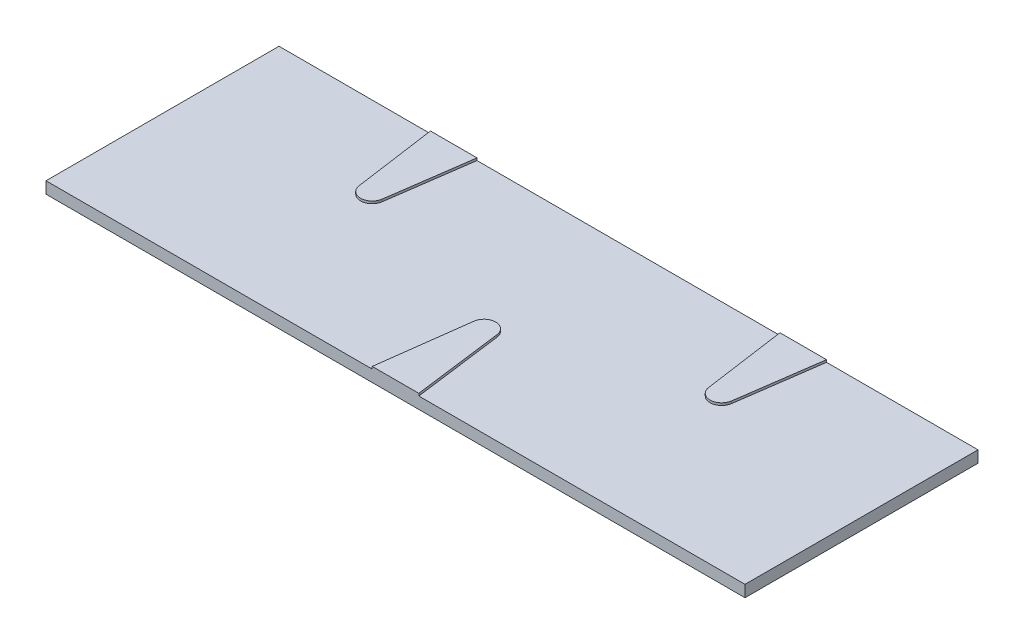
ISO-10303-21;
HEADER;
FILE_DESCRIPTION(('STEP AP214'),'2;1');
FILE_NAME('part.step','',(''),(''),'','','');
FILE_SCHEMA(('AUTOMOTIVE_DESIGN { 1 0 10303 214 1 1 1 1 }'));
ENDSEC;
DATA;
#1=APPLICATION_CONTEXT('core data for automotive mechanical design processes');
#2=APPLICATION_PROTOCOL_DEFINITION('international standard','automotive_design',2000,#1);
#3=PRODUCT_CONTEXT('',#1,'mechanical');
#4=PRODUCT('Part','Part','',(#3));
#5=PRODUCT_RELATED_PRODUCT_CATEGORY('part','',(#4));
#6=PRODUCT_DEFINITION_FORMATION('','',#4);
#7=PRODUCT_DEFINITION_CONTEXT('part definition',#1,'design');
#8=PRODUCT_DEFINITION('design','',#6,#7);
#9=PRODUCT_DEFINITION_SHAPE('','',#8);
#10=(LENGTH_UNIT() NAMED_UNIT(*) SI_UNIT(.MILLI.,.METRE.));
#11=(NAMED_UNIT(*) PLANE_ANGLE_UNIT() SI_UNIT($,.RADIAN.));
#12=(NAMED_UNIT(*) SI_UNIT($,.STERADIAN.) SOLID_ANGLE_UNIT());
#13=UNCERTAINTY_MEASURE_WITH_UNIT(LENGTH_MEASURE(1.E-05),#10,'distance_accuracy_value','');
#14=(GEOMETRIC_REPRESENTATION_CONTEXT(3) GLOBAL_UNCERTAINTY_ASSIGNED_CONTEXT((#13)) GLOBAL_UNIT_ASSIGNED_CONTEXT((#10,
#11,#12)) REPRESENTATION_CONTEXT('',''));
#15=CARTESIAN_POINT('',(0.,0.,0.));
#16=DIRECTION('',(0.,0.,1.));
#17=DIRECTION('',(1.,0.,0.));
#18=AXIS2_PLACEMENT_3D('',#15,#16,#17);
#19=CARTESIAN_POINT('',(0.,5.,0.));
#20=DIRECTION('',(0.,-1.,0.));
#21=DIRECTION('',(0.,0.,-1.));
#22=AXIS2_PLACEMENT_3D('',#19,#20,#21);
#23=PLANE('',#22);
#24=DIRECTION('',(-0.129367555309651,0.,0.991596710176675));
#25=VECTOR('',#24,1.);
#26=CARTESIAN_POINT('',(-10.,5.,50.));
#27=LINE('',#26,#25);
#28=CARTESIAN_POINT('',(-4.95798355088337,5.,11.3531622234518));
#29=VERTEX_POINT('',#28);
#30=CARTESIAN_POINT('',(-10.,5.,50.));
#31=VERTEX_POINT('',#30);
#32=EDGE_CURVE('E48',#29,#31,#27,.T.);
#33=ORIENTED_EDGE('',*,*,#32,.F.);
#34=CARTESIAN_POINT('',(0.,5.,12.));
#35=DIRECTION('',(0.,1.,0.));
#36=DIRECTION('',(0.,0.,-1.));
#37=AXIS2_PLACEMENT_3D('',#34,#35,#36);
#38=CIRCLE('',#37,5.);
#39=CARTESIAN_POINT('',(4.95798355088338,5.,11.3531622234518));
#40=VERTEX_POINT('',#39);
#41=EDGE_CURVE('E53',#40,#29,#38,.T.);
#42=ORIENTED_EDGE('',*,*,#41,.F.);
#43=DIRECTION('',(-0.129367555309651,0.,-0.991596710176675));
#44=VECTOR('',#43,1.);
#45=CARTESIAN_POINT('',(4.95798355088337,5.,11.3531622234518));
#46=LINE('',#45,#44);
#47=CARTESIAN_POINT('',(10.,5.,50.));
#48=VERTEX_POINT('',#47);
#49=EDGE_CURVE('E164',#48,#40,#46,.T.);
#50=ORIENTED_EDGE('',*,*,#49,.F.);
#51=DIRECTION('',(1.,0.,0.));
#52=VECTOR('',#51,1.);
#53=CARTESIAN_POINT('',(-150.,5.,50.));
#54=LINE('',#53,#52);
#55=CARTESIAN_POINT('',(150.,5.,50.));
#56=VERTEX_POINT('',#55);
#57=EDGE_CURVE('E243',#48,#56,#54,.T.);
#58=ORIENTED_EDGE('',*,*,#57,.T.);
#59=DIRECTION('',(0.,0.,-1.));
#60=VECTOR('',#59,1.);
#61=CARTESIAN_POINT('',(150.,5.,50.));
#62=LINE('',#61,#60);
#63=CARTESIAN_POINT('',(150.,5.,-50.));
#64=VERTEX_POINT('',#63);
#65=EDGE_CURVE('E233',#56,#64,#62,.T.);
#66=ORIENTED_EDGE('',*,*,#65,.T.);
#67=DIRECTION('',(-1.,0.,0.));
#68=VECTOR('',#67,1.);
#69=CARTESIAN_POINT('',(-150.,5.,-50.));
#70=LINE('',#69,#68);
#71=CARTESIAN_POINT('',(85.,5.,-50.));
#72=VERTEX_POINT('',#71);
#73=EDGE_CURVE('E238',#64,#72,#70,.T.);
#74=ORIENTED_EDGE('',*,*,#73,.T.);
#75=DIRECTION('',(0.140041605695395,0.,-0.990145619933884));
#76=VECTOR('',#75,1.);
#77=CARTESIAN_POINT('',(85.,5.,-50.));
#78=LINE('',#77,#76);
#79=CARTESIAN_POINT('',(79.9507280996694,5.,-14.299791971523));
#80=VERTEX_POINT('',#79);
#81=EDGE_CURVE('E170',#80,#72,#78,.T.);
#82=ORIENTED_EDGE('',*,*,#81,.F.);
#83=CARTESIAN_POINT('',(75.,5.,-15.));
#84=DIRECTION('',(0.,1.,0.));
#85=DIRECTION('',(0.,0.,-1.));
#86=AXIS2_PLACEMENT_3D('',#83,#84,#85);
#87=CIRCLE('',#86,4.99999999999999);
#88=CARTESIAN_POINT('',(70.0492719003306,5.,-14.299791971523));
#89=VERTEX_POINT('',#88);
#90=EDGE_CURVE('E167',#89,#80,#87,.T.);
#91=ORIENTED_EDGE('',*,*,#90,.F.);
#92=DIRECTION('',(0.140041605695396,0.,0.990145619933884));
#93=VECTOR('',#92,1.);
#94=CARTESIAN_POINT('',(70.0492719003306,5.,-14.299791971523));
#95=LINE('',#94,#93);
#96=CARTESIAN_POINT('',(65.,5.,-50.));
#97=VERTEX_POINT('',#96);
#98=EDGE_CURVE('E180',#97,#89,#95,.T.);
#99=ORIENTED_EDGE('',*,*,#98,.F.);
#100=CARTESIAN_POINT('',(-65.,5.,-50.));
#101=VERTEX_POINT('',#100);
#102=EDGE_CURVE('E241',#97,#101,#70,.T.);
#103=ORIENTED_EDGE('',*,*,#102,.T.);
#104=DIRECTION('',(0.140041605695396,0.,-0.990145619933884));
#105=VECTOR('',#104,1.);
#106=CARTESIAN_POINT('',(-70.0492719003306,5.,-14.299791971523));
#107=LINE('',#106,#105);
#108=CARTESIAN_POINT('',(-70.0492719003306,5.,-14.299791971523));
#109=VERTEX_POINT('',#108);
#110=EDGE_CURVE('E207',#109,#101,#107,.T.);
#111=ORIENTED_EDGE('',*,*,#110,.F.);
#112=CARTESIAN_POINT('',(-75.,5.,-15.));
#113=DIRECTION('',(0.,1.,0.));
#114=DIRECTION('',(0.,0.,1.));
#115=AXIS2_PLACEMENT_3D('',#112,#113,#114);
#116=CIRCLE('',#115,4.99999999999999);
#117=CARTESIAN_POINT('',(-79.9507280996694,5.,-14.299791971523));
#118=VERTEX_POINT('',#117);
#119=EDGE_CURVE('E216',#118,#109,#116,.T.);
#120=ORIENTED_EDGE('',*,*,#119,.F.);
#121=DIRECTION('',(0.140041605695395,0.,0.990145619933884));
#122=VECTOR('',#121,1.);
#123=CARTESIAN_POINT('',(-85.,5.,-50.));
#124=LINE('',#123,#122);
#125=CARTESIAN_POINT('',(-85.,5.,-50.));
#126=VERTEX_POINT('',#125);
#127=EDGE_CURVE('E202',#126,#118,#124,.T.);
#128=ORIENTED_EDGE('',*,*,#127,.F.);
#129=CARTESIAN_POINT('',(-150.,5.,-50.));
#130=VERTEX_POINT('',#129);
#131=EDGE_CURVE('E236',#126,#130,#70,.T.);
#132=ORIENTED_EDGE('',*,*,#131,.T.);
#133=DIRECTION('',(0.,0.,1.));
#134=VECTOR('',#133,1.);
#135=CARTESIAN_POINT('',(-150.,5.,50.));
#136=LINE('',#135,#134);
#137=CARTESIAN_POINT('',(-150.,5.,50.));
#138=VERTEX_POINT('',#137);
#139=EDGE_CURVE('E240',#130,#138,#136,.T.);
#140=ORIENTED_EDGE('',*,*,#139,.T.);
#141=EDGE_CURVE('E244',#138,#31,#54,.T.);
#142=ORIENTED_EDGE('',*,*,#141,.T.);
#143=EDGE_LOOP('',(#33,#42,#50,#58,#66,#74,#82,#91,#99,#103,#111,#120,#128,#132,#140,#142));
#144=FACE_BOUND('',#143,.T.);
#145=ADVANCED_FACE('F33',(#144),#23,.F.);
#146=CARTESIAN_POINT('',(150.,5.,50.));
#147=DIRECTION('',(-1.,0.,0.));
#148=DIRECTION('',(0.,0.,1.));
#149=AXIS2_PLACEMENT_3D('',#146,#147,#148);
#150=PLANE('',#149);
#151=DIRECTION('',(0.,0.,-1.));
#152=VECTOR('',#151,1.);
#153=CARTESIAN_POINT('',(150.,0.,50.));
#154=LINE('',#153,#152);
#155=CARTESIAN_POINT('',(150.,0.,50.));
#156=VERTEX_POINT('',#155);
#157=CARTESIAN_POINT('',(150.,0.,-50.));
#158=VERTEX_POINT('',#157);
#159=EDGE_CURVE('E232',#156,#158,#154,.T.);
#160=ORIENTED_EDGE('',*,*,#159,.T.);
#161=DIRECTION('',(0.,-1.,0.));
#162=VECTOR('',#161,1.);
#163=CARTESIAN_POINT('',(150.,5.,-50.));
#164=LINE('',#163,#162);
#165=EDGE_CURVE('E11',#64,#158,#164,.T.);
#166=ORIENTED_EDGE('',*,*,#165,.F.);
#167=ORIENTED_EDGE('',*,*,#65,.F.);
#168=DIRECTION('',(0.,-1.,0.));
#169=VECTOR('',#168,1.);
#170=CARTESIAN_POINT('',(150.,5.,50.));
#171=LINE('',#170,#169);
#172=EDGE_CURVE('E246',#56,#156,#171,.T.);
#173=ORIENTED_EDGE('',*,*,#172,.T.);
#174=EDGE_LOOP('',(#160,#166,#167,#173));
#175=FACE_BOUND('',#174,.T.);
#176=ADVANCED_FACE('F35',(#175),#150,.F.);
#177=CARTESIAN_POINT('',(-150.,5.,-50.));
#178=DIRECTION('',(0.,0.,1.));
#179=DIRECTION('',(1.,0.,0.));
#180=AXIS2_PLACEMENT_3D('',#177,#178,#179);
#181=PLANE('',#180);
#182=DIRECTION('',(-1.,0.,0.));
#183=VECTOR('',#182,1.);
#184=CARTESIAN_POINT('',(-150.,0.,-50.));
#185=LINE('',#184,#183);
#186=CARTESIAN_POINT('',(-150.,0.,-50.));
#187=VERTEX_POINT('',#186);
#188=EDGE_CURVE('E249',#158,#187,#185,.T.);
#189=ORIENTED_EDGE('',*,*,#188,.T.);
#190=DIRECTION('',(0.,-1.,0.));
#191=VECTOR('',#190,1.);
#192=CARTESIAN_POINT('',(-150.,5.,-50.));
#193=LINE('',#192,#191);
#194=EDGE_CURVE('E41',#130,#187,#193,.T.);
#195=ORIENTED_EDGE('',*,*,#194,.F.);
#196=ORIENTED_EDGE('',*,*,#131,.F.);
#197=DIRECTION('',(0.,-1.,0.));
#198=VECTOR('',#197,1.);
#199=CARTESIAN_POINT('',(-85.,6.,-50.));
#200=LINE('',#199,#198);
#201=CARTESIAN_POINT('',(-85.,6.,-50.));
#202=VERTEX_POINT('',#201);
#203=EDGE_CURVE('E229',#202,#126,#200,.T.);
#204=ORIENTED_EDGE('',*,*,#203,.F.);
#205=DIRECTION('',(-1.,0.,0.));
#206=VECTOR('',#205,1.);
#207=CARTESIAN_POINT('',(-85.,6.,-50.));
#208=LINE('',#207,#206);
#209=CARTESIAN_POINT('',(-65.,6.,-50.));
#210=VERTEX_POINT('',#209);
#211=EDGE_CURVE('E203',#210,#202,#208,.T.);
#212=ORIENTED_EDGE('',*,*,#211,.F.);
#213=DIRECTION('',(0.,-1.,0.));
#214=VECTOR('',#213,1.);
#215=CARTESIAN_POINT('',(-65.,6.,-50.));
#216=LINE('',#215,#214);
#217=EDGE_CURVE('E213',#210,#101,#216,.T.);
#218=ORIENTED_EDGE('',*,*,#217,.T.);
#219=ORIENTED_EDGE('',*,*,#102,.F.);
#220=DIRECTION('',(0.,-1.,0.));
#221=VECTOR('',#220,1.);
#222=CARTESIAN_POINT('',(65.,6.,-50.));
#223=LINE('',#222,#221);
#224=CARTESIAN_POINT('',(65.,6.,-50.));
#225=VERTEX_POINT('',#224);
#226=EDGE_CURVE('E193',#225,#97,#223,.T.);
#227=ORIENTED_EDGE('',*,*,#226,.F.);
#228=DIRECTION('',(-1.,0.,0.));
#229=VECTOR('',#228,1.);
#230=CARTESIAN_POINT('',(65.,6.,-50.));
#231=LINE('',#230,#229);
#232=CARTESIAN_POINT('',(85.,6.,-50.));
#233=VERTEX_POINT('',#232);
#234=EDGE_CURVE('E182',#233,#225,#231,.T.);
#235=ORIENTED_EDGE('',*,*,#234,.F.);
#236=DIRECTION('',(0.,-1.,0.));
#237=VECTOR('',#236,1.);
#238=CARTESIAN_POINT('',(85.,6.,-50.));
#239=LINE('',#238,#237);
#240=EDGE_CURVE('E196',#233,#72,#239,.T.);
#241=ORIENTED_EDGE('',*,*,#240,.T.);
#242=ORIENTED_EDGE('',*,*,#73,.F.);
#243=ORIENTED_EDGE('',*,*,#165,.T.);
#244=EDGE_LOOP('',(#189,#195,#196,#204,#212,#218,#219,#227,#235,#241,#242,#243));
#245=FACE_BOUND('',#244,.T.);
#246=ADVANCED_FACE('F298',(#245),#181,.F.);
#247=CARTESIAN_POINT('',(-150.,5.,50.));
#248=DIRECTION('',(1.,0.,0.));
#249=DIRECTION('',(0.,0.,-1.));
#250=AXIS2_PLACEMENT_3D('',#247,#248,#249);
#251=PLANE('',#250);
#252=DIRECTION('',(0.,0.,1.));
#253=VECTOR('',#252,1.);
#254=CARTESIAN_POINT('',(-150.,0.,50.));
#255=LINE('',#254,#253);
#256=CARTESIAN_POINT('',(-150.,0.,50.));
#257=VERTEX_POINT('',#256);
#258=EDGE_CURVE('E251',#187,#257,#255,.T.);
#259=ORIENTED_EDGE('',*,*,#258,.T.);
#260=DIRECTION('',(0.,-1.,0.));
#261=VECTOR('',#260,1.);
#262=CARTESIAN_POINT('',(-150.,5.,50.));
#263=LINE('',#262,#261);
#264=EDGE_CURVE('E256',#138,#257,#263,.T.);
#265=ORIENTED_EDGE('',*,*,#264,.F.);
#266=ORIENTED_EDGE('',*,*,#139,.F.);
#267=ORIENTED_EDGE('',*,*,#194,.T.);
#268=EDGE_LOOP('',(#259,#265,#266,#267));
#269=FACE_BOUND('',#268,.T.);
#270=ADVANCED_FACE('F263',(#269),#251,.F.);
#271=CARTESIAN_POINT('',(-150.,5.,50.));
#272=DIRECTION('',(0.,0.,-1.));
#273=DIRECTION('',(-1.,0.,0.));
#274=AXIS2_PLACEMENT_3D('',#271,#272,#273);
#275=PLANE('',#274);
#276=DIRECTION('',(1.,0.,0.));
#277=VECTOR('',#276,1.);
#278=CARTESIAN_POINT('',(-150.,0.,50.));
#279=LINE('',#278,#277);
#280=EDGE_CURVE('E237',#257,#156,#279,.T.);
#281=ORIENTED_EDGE('',*,*,#280,.T.);
#282=ORIENTED_EDGE('',*,*,#172,.F.);
#283=ORIENTED_EDGE('',*,*,#57,.F.);
#284=DIRECTION('',(0.,-1.,0.));
#285=VECTOR('',#284,1.);
#286=CARTESIAN_POINT('',(10.,6.,50.));
#287=LINE('',#286,#285);
#288=CARTESIAN_POINT('',(10.,6.,50.));
#289=VERTEX_POINT('',#288);
#290=EDGE_CURVE('E172',#289,#48,#287,.T.);
#291=ORIENTED_EDGE('',*,*,#290,.F.);
#292=DIRECTION('',(1.,0.,0.));
#293=VECTOR('',#292,1.);
#294=CARTESIAN_POINT('',(10.,6.,50.));
#295=LINE('',#294,#293);
#296=CARTESIAN_POINT('',(-10.,6.,50.));
#297=VERTEX_POINT('',#296);
#298=EDGE_CURVE('E154',#297,#289,#295,.T.);
#299=ORIENTED_EDGE('',*,*,#298,.F.);
#300=DIRECTION('',(0.,-1.,0.));
#301=VECTOR('',#300,1.);
#302=CARTESIAN_POINT('',(-10.,6.,50.));
#303=LINE('',#302,#301);
#304=EDGE_CURVE('E151',#297,#31,#303,.T.);
#305=ORIENTED_EDGE('',*,*,#304,.T.);
#306=ORIENTED_EDGE('',*,*,#141,.F.);
#307=ORIENTED_EDGE('',*,*,#264,.T.);
#308=EDGE_LOOP('',(#281,#282,#283,#291,#299,#305,#306,#307));
#309=FACE_BOUND('',#308,.T.);
#310=ADVANCED_FACE('F273',(#309),#275,.F.);
#311=CARTESIAN_POINT('',(0.,0.,0.));
#312=DIRECTION('',(0.,-1.,0.));
#313=DIRECTION('',(0.,0.,-1.));
#314=AXIS2_PLACEMENT_3D('',#311,#312,#313);
#315=PLANE('',#314);
#316=ORIENTED_EDGE('',*,*,#159,.F.);
#317=ORIENTED_EDGE('',*,*,#280,.F.);
#318=ORIENTED_EDGE('',*,*,#258,.F.);
#319=ORIENTED_EDGE('',*,*,#188,.F.);
#320=EDGE_LOOP('',(#316,#317,#318,#319));
#321=FACE_BOUND('',#320,.T.);
#322=ADVANCED_FACE('F270',(#321),#315,.T.);
#323=CARTESIAN_POINT('',(-85.,6.,-50.));
#324=DIRECTION('',(0.990145619933884,0.,-0.140041605695395));
#325=DIRECTION('',(-0.140041605695395,0.,-0.990145619933884));
#326=AXIS2_PLACEMENT_3D('',#323,#324,#325);
#327=PLANE('',#326);
#328=ORIENTED_EDGE('',*,*,#127,.T.);
#329=DIRECTION('',(0.,-1.,0.));
#330=VECTOR('',#329,1.);
#331=CARTESIAN_POINT('',(-79.9507280996694,6.,-14.299791971523));
#332=LINE('',#331,#330);
#333=CARTESIAN_POINT('',(-79.9507280996694,6.,-14.299791971523));
#334=VERTEX_POINT('',#333);
#335=EDGE_CURVE('E226',#334,#118,#332,.T.);
#336=ORIENTED_EDGE('',*,*,#335,.F.);
#337=DIRECTION('',(0.140041605695395,0.,0.990145619933884));
#338=VECTOR('',#337,1.);
#339=CARTESIAN_POINT('',(-85.,6.,-50.));
#340=LINE('',#339,#338);
#341=EDGE_CURVE('E206',#202,#334,#340,.T.);
#342=ORIENTED_EDGE('',*,*,#341,.F.);
#343=ORIENTED_EDGE('',*,*,#203,.T.);
#344=EDGE_LOOP('',(#328,#336,#342,#343));
#345=FACE_BOUND('',#344,.T.);
#346=ADVANCED_FACE('F306',(#345),#327,.F.);
#347=CARTESIAN_POINT('',(-75.,6.,-15.));
#348=DIRECTION('',(0.,-1.,0.));
#349=DIRECTION('',(0.,0.,-1.));
#350=AXIS2_PLACEMENT_3D('',#347,#348,#349);
#351=CYLINDRICAL_SURFACE('',#350,4.99999999999999);
#352=ORIENTED_EDGE('',*,*,#119,.T.);
#353=DIRECTION('',(0.,-1.,0.));
#354=VECTOR('',#353,1.);
#355=CARTESIAN_POINT('',(-70.0492719003306,6.,-14.299791971523));
#356=LINE('',#355,#354);
#357=CARTESIAN_POINT('',(-70.0492719003306,6.,-14.299791971523));
#358=VERTEX_POINT('',#357);
#359=EDGE_CURVE('E223',#358,#109,#356,.T.);
#360=ORIENTED_EDGE('',*,*,#359,.F.);
#361=CARTESIAN_POINT('',(-75.,6.,-15.));
#362=DIRECTION('',(0.,1.,0.));
#363=DIRECTION('',(0.,0.,1.));
#364=AXIS2_PLACEMENT_3D('',#361,#362,#363);
#365=CIRCLE('',#364,4.99999999999999);
#366=EDGE_CURVE('E209',#334,#358,#365,.T.);
#367=ORIENTED_EDGE('',*,*,#366,.F.);
#368=ORIENTED_EDGE('',*,*,#335,.T.);
#369=EDGE_LOOP('',(#352,#360,#367,#368));
#370=FACE_BOUND('',#369,.T.);
#371=ADVANCED_FACE('F304',(#370),#351,.T.);
#372=CARTESIAN_POINT('',(-70.0492719003306,6.,-14.299791971523));
#373=DIRECTION('',(-0.990145619933884,0.,-0.140041605695396));
#374=DIRECTION('',(-0.140041605695396,0.,0.990145619933884));
#375=AXIS2_PLACEMENT_3D('',#372,#373,#374);
#376=PLANE('',#375);
#377=ORIENTED_EDGE('',*,*,#110,.T.);
#378=ORIENTED_EDGE('',*,*,#217,.F.);
#379=DIRECTION('',(0.140041605695396,0.,-0.990145619933884));
#380=VECTOR('',#379,1.);
#381=CARTESIAN_POINT('',(-70.0492719003306,6.,-14.299791971523));
#382=LINE('',#381,#380);
#383=EDGE_CURVE('E211',#358,#210,#382,.T.);
#384=ORIENTED_EDGE('',*,*,#383,.F.);
#385=ORIENTED_EDGE('',*,*,#359,.T.);
#386=EDGE_LOOP('',(#377,#378,#384,#385));
#387=FACE_BOUND('',#386,.T.);
#388=ADVANCED_FACE('F294',(#387),#376,.F.);
#389=CARTESIAN_POINT('',(-75.,6.,-15.));
#390=DIRECTION('',(0.,1.,0.));
#391=DIRECTION('',(0.,0.,1.));
#392=AXIS2_PLACEMENT_3D('',#389,#390,#391);
#393=PLANE('',#392);
#394=ORIENTED_EDGE('',*,*,#211,.T.);
#395=ORIENTED_EDGE('',*,*,#341,.T.);
#396=ORIENTED_EDGE('',*,*,#366,.T.);
#397=ORIENTED_EDGE('',*,*,#383,.T.);
#398=EDGE_LOOP('',(#394,#395,#396,#397));
#399=FACE_BOUND('',#398,.T.);
#400=ADVANCED_FACE('F300',(#399),#393,.T.);
#401=CARTESIAN_POINT('',(75.,6.,-15.));
#402=DIRECTION('',(0.,-1.,0.));
#403=DIRECTION('',(0.,0.,-1.));
#404=AXIS2_PLACEMENT_3D('',#401,#402,#403);
#405=CYLINDRICAL_SURFACE('',#404,4.99999999999999);
#406=ORIENTED_EDGE('',*,*,#90,.T.);
#407=DIRECTION('',(0.,-1.,0.));
#408=VECTOR('',#407,1.);
#409=CARTESIAN_POINT('',(79.9507280996694,6.,-14.299791971523));
#410=LINE('',#409,#408);
#411=CARTESIAN_POINT('',(79.9507280996694,6.,-14.299791971523));
#412=VERTEX_POINT('',#411);
#413=EDGE_CURVE('E199',#412,#80,#410,.T.);
#414=ORIENTED_EDGE('',*,*,#413,.F.);
#415=CARTESIAN_POINT('',(75.,6.,-15.));
#416=DIRECTION('',(0.,1.,0.));
#417=DIRECTION('',(0.,0.,-1.));
#418=AXIS2_PLACEMENT_3D('',#415,#416,#417);
#419=CIRCLE('',#418,4.99999999999999);
#420=CARTESIAN_POINT('',(70.0492719003306,6.,-14.299791971523));
#421=VERTEX_POINT('',#420);
#422=EDGE_CURVE('E176',#421,#412,#419,.T.);
#423=ORIENTED_EDGE('',*,*,#422,.F.);
#424=DIRECTION('',(0.,-1.,0.));
#425=VECTOR('',#424,1.);
#426=CARTESIAN_POINT('',(70.0492719003306,6.,-14.299791971523));
#427=LINE('',#426,#425);
#428=EDGE_CURVE('E185',#421,#89,#427,.T.);
#429=ORIENTED_EDGE('',*,*,#428,.T.);
#430=EDGE_LOOP('',(#406,#414,#423,#429));
#431=FACE_BOUND('',#430,.T.);
#432=ADVANCED_FACE('F385',(#431),#405,.T.);
#433=CARTESIAN_POINT('',(85.,6.,-50.));
#434=DIRECTION('',(-0.990145619933884,0.,-0.140041605695395));
#435=DIRECTION('',(-0.140041605695395,0.,0.990145619933884));
#436=AXIS2_PLACEMENT_3D('',#433,#434,#435);
#437=PLANE('',#436);
#438=ORIENTED_EDGE('',*,*,#81,.T.);
#439=ORIENTED_EDGE('',*,*,#240,.F.);
#440=DIRECTION('',(0.140041605695395,0.,-0.990145619933884));
#441=VECTOR('',#440,1.);
#442=CARTESIAN_POINT('',(85.,6.,-50.));
#443=LINE('',#442,#441);
#444=EDGE_CURVE('E179',#412,#233,#443,.T.);
#445=ORIENTED_EDGE('',*,*,#444,.F.);
#446=ORIENTED_EDGE('',*,*,#413,.T.);
#447=EDGE_LOOP('',(#438,#439,#445,#446));
#448=FACE_BOUND('',#447,.T.);
#449=ADVANCED_FACE('F393',(#448),#437,.F.);
#450=CARTESIAN_POINT('',(70.0492719003306,6.,-14.299791971523));
#451=DIRECTION('',(0.990145619933884,0.,-0.140041605695396));
#452=DIRECTION('',(-0.140041605695396,0.,-0.990145619933884));
#453=AXIS2_PLACEMENT_3D('',#450,#451,#452);
#454=PLANE('',#453);
#455=ORIENTED_EDGE('',*,*,#98,.T.);
#456=ORIENTED_EDGE('',*,*,#428,.F.);
#457=DIRECTION('',(0.140041605695396,0.,0.990145619933884));
#458=VECTOR('',#457,1.);
#459=CARTESIAN_POINT('',(70.0492719003306,6.,-14.299791971523));
#460=LINE('',#459,#458);
#461=EDGE_CURVE('E184',#225,#421,#460,.T.);
#462=ORIENTED_EDGE('',*,*,#461,.F.);
#463=ORIENTED_EDGE('',*,*,#226,.T.);
#464=EDGE_LOOP('',(#455,#456,#462,#463));
#465=FACE_BOUND('',#464,.T.);
#466=ADVANCED_FACE('F402',(#465),#454,.F.);
#467=CARTESIAN_POINT('',(75.,6.,-15.));
#468=DIRECTION('',(0.,-1.,0.));
#469=DIRECTION('',(0.,0.,-1.));
#470=AXIS2_PLACEMENT_3D('',#467,#468,#469);
#471=PLANE('',#470);
#472=ORIENTED_EDGE('',*,*,#422,.T.);
#473=ORIENTED_EDGE('',*,*,#444,.T.);
#474=ORIENTED_EDGE('',*,*,#234,.T.);
#475=ORIENTED_EDGE('',*,*,#461,.T.);
#476=EDGE_LOOP('',(#472,#473,#474,#475));
#477=FACE_BOUND('',#476,.T.);
#478=ADVANCED_FACE('F411',(#477),#471,.F.);
#479=CARTESIAN_POINT('',(0.,6.,12.));
#480=DIRECTION('',(0.,-1.,0.));
#481=DIRECTION('',(0.,0.,-1.));
#482=AXIS2_PLACEMENT_3D('',#479,#480,#481);
#483=CYLINDRICAL_SURFACE('',#482,5.);
#484=ORIENTED_EDGE('',*,*,#41,.T.);
#485=DIRECTION('',(0.,-1.,0.));
#486=VECTOR('',#485,1.);
#487=CARTESIAN_POINT('',(-4.95798355088337,6.,11.3531622234518));
#488=LINE('',#487,#486);
#489=CARTESIAN_POINT('',(-4.95798355088337,6.,11.3531622234518));
#490=VERTEX_POINT('',#489);
#491=EDGE_CURVE('E149',#490,#29,#488,.T.);
#492=ORIENTED_EDGE('',*,*,#491,.F.);
#493=CARTESIAN_POINT('',(0.,6.,12.));
#494=DIRECTION('',(0.,1.,0.));
#495=DIRECTION('',(0.,0.,-1.));
#496=AXIS2_PLACEMENT_3D('',#493,#494,#495);
#497=CIRCLE('',#496,5.);
#498=CARTESIAN_POINT('',(4.95798355088337,6.,11.3531622234518));
#499=VERTEX_POINT('',#498);
#500=EDGE_CURVE('E155',#499,#490,#497,.T.);
#501=ORIENTED_EDGE('',*,*,#500,.F.);
#502=DIRECTION('',(0.,-1.,0.));
#503=VECTOR('',#502,1.);
#504=CARTESIAN_POINT('',(4.95798355088337,6.,11.3531622234518));
#505=LINE('',#504,#503);
#506=EDGE_CURVE('E281',#499,#40,#505,.T.);
#507=ORIENTED_EDGE('',*,*,#506,.T.);
#508=EDGE_LOOP('',(#484,#492,#501,#507));
#509=FACE_BOUND('',#508,.T.);
#510=ADVANCED_FACE('F166',(#509),#483,.T.);
#511=CARTESIAN_POINT('',(-10.,6.,50.));
#512=DIRECTION('',(0.991596710176675,0.,0.129367555309651));
#513=DIRECTION('',(0.129367555309651,0.,-0.991596710176675));
#514=AXIS2_PLACEMENT_3D('',#511,#512,#513);
#515=PLANE('',#514);
#516=ORIENTED_EDGE('',*,*,#32,.T.);
#517=ORIENTED_EDGE('',*,*,#304,.F.);
#518=DIRECTION('',(-0.129367555309651,0.,0.991596710176675));
#519=VECTOR('',#518,1.);
#520=CARTESIAN_POINT('',(-10.,6.,50.));
#521=LINE('',#520,#519);
#522=EDGE_CURVE('E145',#490,#297,#521,.T.);
#523=ORIENTED_EDGE('',*,*,#522,.F.);
#524=ORIENTED_EDGE('',*,*,#491,.T.);
#525=EDGE_LOOP('',(#516,#517,#523,#524));
#526=FACE_BOUND('',#525,.T.);
#527=ADVANCED_FACE('F147',(#526),#515,.F.);
#528=CARTESIAN_POINT('',(4.95798355088337,6.,11.3531622234518));
#529=DIRECTION('',(-0.991596710176675,0.,0.129367555309651));
#530=DIRECTION('',(0.129367555309651,0.,0.991596710176675));
#531=AXIS2_PLACEMENT_3D('',#528,#529,#530);
#532=PLANE('',#531);
#533=ORIENTED_EDGE('',*,*,#49,.T.);
#534=ORIENTED_EDGE('',*,*,#506,.F.);
#535=DIRECTION('',(-0.129367555309651,0.,-0.991596710176675));
#536=VECTOR('',#535,1.);
#537=CARTESIAN_POINT('',(4.95798355088337,6.,11.3531622234518));
#538=LINE('',#537,#536);
#539=EDGE_CURVE('E160',#289,#499,#538,.T.);
#540=ORIENTED_EDGE('',*,*,#539,.F.);
#541=ORIENTED_EDGE('',*,*,#290,.T.);
#542=EDGE_LOOP('',(#533,#534,#540,#541));
#543=FACE_BOUND('',#542,.T.);
#544=ADVANCED_FACE('F282',(#543),#532,.F.);
#545=CARTESIAN_POINT('',(0.,6.,12.));
#546=DIRECTION('',(0.,-1.,0.));
#547=DIRECTION('',(0.,0.,-1.));
#548=AXIS2_PLACEMENT_3D('',#545,#546,#547);
#549=PLANE('',#548);
#550=ORIENTED_EDGE('',*,*,#500,.T.);
#551=ORIENTED_EDGE('',*,*,#522,.T.);
#552=ORIENTED_EDGE('',*,*,#298,.T.);
#553=ORIENTED_EDGE('',*,*,#539,.T.);
#554=EDGE_LOOP('',(#550,#551,#552,#553));
#555=FACE_BOUND('',#554,.T.);
#556=ADVANCED_FACE('F158',(#555),#549,.F.);
#557=CLOSED_SHELL('',(#145,#176,#246,#270,#310,#322,#346,#371,#388,#400,#432,#449,#466,#478,
#510,#527,#544,#556));
#558=MANIFOLD_SOLID_BREP('B2',#557);
#559=ADVANCED_BREP_SHAPE_REPRESENTATION('',(#18,#558),#14);
#560=SHAPE_DEFINITION_REPRESENTATION(#9,#559);
ENDSEC;
END-ISO-10303-21;
